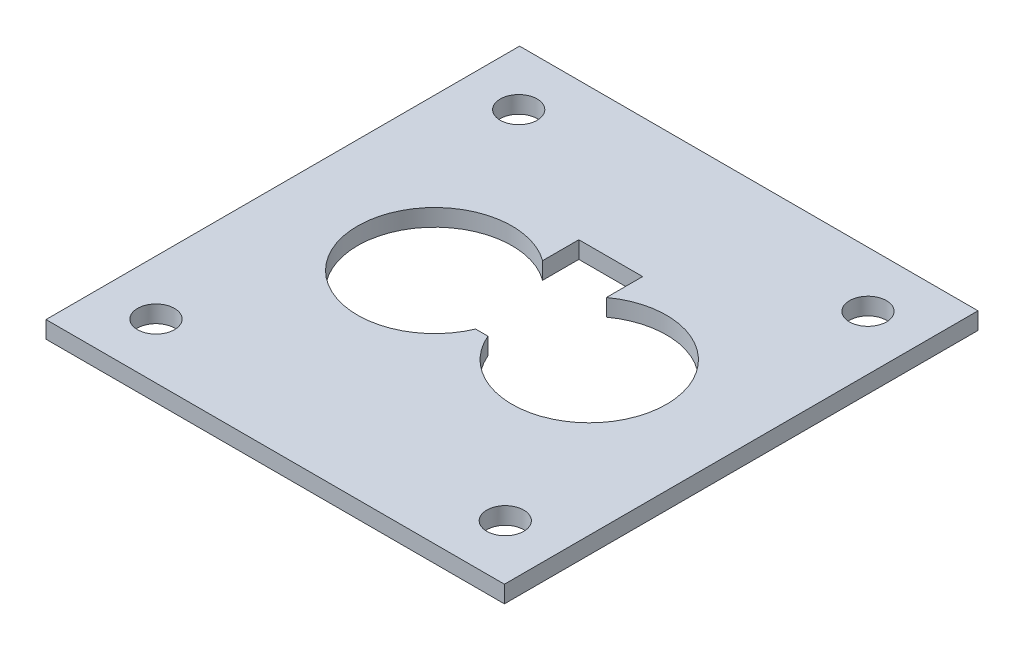
ISO-10303-21;
HEADER;
FILE_DESCRIPTION(('STEP AP214'),'2;1');
FILE_NAME('part.step','',(''),(''),'','','');
FILE_SCHEMA(('AUTOMOTIVE_DESIGN { 1 0 10303 214 1 1 1 1 }'));
ENDSEC;
DATA;
#1=APPLICATION_CONTEXT('core data for automotive mechanical design processes');
#2=APPLICATION_PROTOCOL_DEFINITION('international standard','automotive_design',2000,#1);
#3=PRODUCT_CONTEXT('',#1,'mechanical');
#4=PRODUCT('Part','Part','',(#3));
#5=PRODUCT_RELATED_PRODUCT_CATEGORY('part','',(#4));
#6=PRODUCT_DEFINITION_FORMATION('','',#4);
#7=PRODUCT_DEFINITION_CONTEXT('part definition',#1,'design');
#8=PRODUCT_DEFINITION('design','',#6,#7);
#9=PRODUCT_DEFINITION_SHAPE('','',#8);
#10=(LENGTH_UNIT() NAMED_UNIT(*) SI_UNIT(.MILLI.,.METRE.));
#11=(NAMED_UNIT(*) PLANE_ANGLE_UNIT() SI_UNIT($,.RADIAN.));
#12=(NAMED_UNIT(*) SI_UNIT($,.STERADIAN.) SOLID_ANGLE_UNIT());
#13=UNCERTAINTY_MEASURE_WITH_UNIT(LENGTH_MEASURE(1.E-05),#10,'distance_accuracy_value','');
#14=(GEOMETRIC_REPRESENTATION_CONTEXT(3) GLOBAL_UNCERTAINTY_ASSIGNED_CONTEXT((#13)) GLOBAL_UNIT_ASSIGNED_CONTEXT((#10,
#11,#12)) REPRESENTATION_CONTEXT('',''));
#15=CARTESIAN_POINT('',(0.,0.,0.));
#16=DIRECTION('',(0.,0.,1.));
#17=DIRECTION('',(1.,0.,0.));
#18=AXIS2_PLACEMENT_3D('',#15,#16,#17);
#19=CARTESIAN_POINT('',(34.1243299967711,2.54,35.2524070214577));
#20=DIRECTION('',(-1.,0.,0.));
#21=DIRECTION('',(0.,0.,1.));
#22=AXIS2_PLACEMENT_3D('',#19,#20,#21);
#23=PLANE('',#22);
#24=DIRECTION('',(0.,0.,-1.));
#25=VECTOR('',#24,1.);
#26=CARTESIAN_POINT('',(34.1243299967711,0.,35.2524070214577));
#27=LINE('',#26,#25);
#28=CARTESIAN_POINT('',(34.1243299967711,0.,35.2524070214577));
#29=VERTEX_POINT('',#28);
#30=CARTESIAN_POINT('',(34.1243299967711,0.,-35.2524070214577));
#31=VERTEX_POINT('',#30);
#32=EDGE_CURVE('E220',#29,#31,#27,.T.);
#33=ORIENTED_EDGE('',*,*,#32,.T.);
#34=DIRECTION('',(0.,-1.,0.));
#35=VECTOR('',#34,1.);
#36=CARTESIAN_POINT('',(34.1243299967711,2.54,-35.2524070214577));
#37=LINE('',#36,#35);
#38=CARTESIAN_POINT('',(34.1243299967711,2.54,-35.2524070214577));
#39=VERTEX_POINT('',#38);
#40=EDGE_CURVE('E11',#39,#31,#37,.T.);
#41=ORIENTED_EDGE('',*,*,#40,.F.);
#42=DIRECTION('',(0.,0.,-1.));
#43=VECTOR('',#42,1.);
#44=CARTESIAN_POINT('',(34.1243299967711,2.54,35.2524070214577));
#45=LINE('',#44,#43);
#46=CARTESIAN_POINT('',(34.1243299967711,2.54,35.2524070214577));
#47=VERTEX_POINT('',#46);
#48=EDGE_CURVE('E221',#47,#39,#45,.T.);
#49=ORIENTED_EDGE('',*,*,#48,.F.);
#50=DIRECTION('',(0.,-1.,0.));
#51=VECTOR('',#50,1.);
#52=CARTESIAN_POINT('',(34.1243299967711,2.54,35.2524070214577));
#53=LINE('',#52,#51);
#54=EDGE_CURVE('E235',#47,#29,#53,.T.);
#55=ORIENTED_EDGE('',*,*,#54,.T.);
#56=EDGE_LOOP('',(#33,#41,#49,#55));
#57=FACE_BOUND('',#56,.T.);
#58=ADVANCED_FACE('F43',(#57),#23,.F.);
#59=CARTESIAN_POINT('',(-34.1243299967711,2.54,-35.2524070214577));
#60=DIRECTION('',(0.,0.,1.));
#61=DIRECTION('',(1.,0.,0.));
#62=AXIS2_PLACEMENT_3D('',#59,#60,#61);
#63=PLANE('',#62);
#64=DIRECTION('',(-1.,0.,0.));
#65=VECTOR('',#64,1.);
#66=CARTESIAN_POINT('',(-34.1243299967711,0.,-35.2524070214577));
#67=LINE('',#66,#65);
#68=CARTESIAN_POINT('',(-34.1243299967711,0.,-35.2524070214577));
#69=VERTEX_POINT('',#68);
#70=EDGE_CURVE('E239',#31,#69,#67,.T.);
#71=ORIENTED_EDGE('',*,*,#70,.T.);
#72=DIRECTION('',(0.,-1.,0.));
#73=VECTOR('',#72,1.);
#74=CARTESIAN_POINT('',(-34.1243299967711,2.54,-35.2524070214577));
#75=LINE('',#74,#73);
#76=CARTESIAN_POINT('',(-34.1243299967711,2.54,-35.2524070214577));
#77=VERTEX_POINT('',#76);
#78=EDGE_CURVE('E51',#77,#69,#75,.T.);
#79=ORIENTED_EDGE('',*,*,#78,.F.);
#80=DIRECTION('',(-1.,0.,0.));
#81=VECTOR('',#80,1.);
#82=CARTESIAN_POINT('',(-34.1243299967711,2.54,-35.2524070214577));
#83=LINE('',#82,#81);
#84=EDGE_CURVE('E225',#39,#77,#83,.T.);
#85=ORIENTED_EDGE('',*,*,#84,.F.);
#86=ORIENTED_EDGE('',*,*,#40,.T.);
#87=EDGE_LOOP('',(#71,#79,#85,#86));
#88=FACE_BOUND('',#87,.T.);
#89=ADVANCED_FACE('F274',(#88),#63,.F.);
#90=CARTESIAN_POINT('',(-34.1243299967711,2.54,35.2524070214577));
#91=DIRECTION('',(1.,0.,0.));
#92=DIRECTION('',(0.,0.,-1.));
#93=AXIS2_PLACEMENT_3D('',#90,#91,#92);
#94=PLANE('',#93);
#95=DIRECTION('',(0.,0.,1.));
#96=VECTOR('',#95,1.);
#97=CARTESIAN_POINT('',(-34.1243299967711,0.,35.2524070214577));
#98=LINE('',#97,#96);
#99=CARTESIAN_POINT('',(-34.1243299967711,0.,35.2524070214577));
#100=VERTEX_POINT('',#99);
#101=EDGE_CURVE('E242',#69,#100,#98,.T.);
#102=ORIENTED_EDGE('',*,*,#101,.T.);
#103=DIRECTION('',(0.,-1.,0.));
#104=VECTOR('',#103,1.);
#105=CARTESIAN_POINT('',(-34.1243299967711,2.54,35.2524070214577));
#106=LINE('',#105,#104);
#107=CARTESIAN_POINT('',(-34.1243299967711,2.54,35.2524070214577));
#108=VERTEX_POINT('',#107);
#109=EDGE_CURVE('E250',#108,#100,#106,.T.);
#110=ORIENTED_EDGE('',*,*,#109,.F.);
#111=DIRECTION('',(0.,0.,1.));
#112=VECTOR('',#111,1.);
#113=CARTESIAN_POINT('',(-34.1243299967711,2.54,35.2524070214577));
#114=LINE('',#113,#112);
#115=EDGE_CURVE('E229',#77,#108,#114,.T.);
#116=ORIENTED_EDGE('',*,*,#115,.F.);
#117=ORIENTED_EDGE('',*,*,#78,.T.);
#118=EDGE_LOOP('',(#102,#110,#116,#117));
#119=FACE_BOUND('',#118,.T.);
#120=ADVANCED_FACE('F259',(#119),#94,.F.);
#121=CARTESIAN_POINT('',(-34.1243299967711,2.54,35.2524070214577));
#122=DIRECTION('',(0.,0.,-1.));
#123=DIRECTION('',(-1.,0.,0.));
#124=AXIS2_PLACEMENT_3D('',#121,#122,#123);
#125=PLANE('',#124);
#126=DIRECTION('',(1.,0.,0.));
#127=VECTOR('',#126,1.);
#128=CARTESIAN_POINT('',(-34.1243299967711,0.,35.2524070214577));
#129=LINE('',#128,#127);
#130=EDGE_CURVE('E226',#100,#29,#129,.T.);
#131=ORIENTED_EDGE('',*,*,#130,.T.);
#132=ORIENTED_EDGE('',*,*,#54,.F.);
#133=DIRECTION('',(1.,0.,0.));
#134=VECTOR('',#133,1.);
#135=CARTESIAN_POINT('',(-34.1243299967711,2.54,35.2524070214577));
#136=LINE('',#135,#134);
#137=EDGE_CURVE('E232',#108,#47,#136,.T.);
#138=ORIENTED_EDGE('',*,*,#137,.F.);
#139=ORIENTED_EDGE('',*,*,#109,.T.);
#140=EDGE_LOOP('',(#131,#132,#138,#139));
#141=FACE_BOUND('',#140,.T.);
#142=ADVANCED_FACE('F267',(#141),#125,.F.);
#143=CARTESIAN_POINT('',(0.,2.54,0.));
#144=DIRECTION('',(0.,-1.,0.));
#145=DIRECTION('',(0.,0.,-1.));
#146=AXIS2_PLACEMENT_3D('',#143,#144,#145);
#147=PLANE('',#146);
#148=CARTESIAN_POINT('',(11.5,2.54,0.));
#149=DIRECTION('',(0.,1.,0.));
#150=DIRECTION('',(0.,0.,1.));
#151=AXIS2_PLACEMENT_3D('',#148,#149,#150);
#152=CIRCLE('',#151,11.5);
#153=CARTESIAN_POINT('',(0.916994755741638,2.54,4.5));
#154=VERTEX_POINT('',#153);
#155=CARTESIAN_POINT('',(4.75,2.54,-9.31061222476804));
#156=VERTEX_POINT('',#155);
#157=EDGE_CURVE('E160',#154,#156,#152,.T.);
#158=ORIENTED_EDGE('',*,*,#157,.F.);
#159=DIRECTION('',(1.,0.,0.));
#160=VECTOR('',#159,1.);
#161=CARTESIAN_POINT('',(0.,2.54,4.5));
#162=LINE('',#161,#160);
#163=CARTESIAN_POINT('',(-0.916994755741637,2.54,4.5));
#164=VERTEX_POINT('',#163);
#165=EDGE_CURVE('E58',#164,#154,#162,.T.);
#166=ORIENTED_EDGE('',*,*,#165,.F.);
#167=CARTESIAN_POINT('',(-11.5,2.54,0.));
#168=DIRECTION('',(0.,1.,0.));
#169=DIRECTION('',(0.,0.,1.));
#170=AXIS2_PLACEMENT_3D('',#167,#168,#169);
#171=CIRCLE('',#170,11.5);
#172=CARTESIAN_POINT('',(-4.75,2.54,-9.31061222476803));
#173=VERTEX_POINT('',#172);
#174=EDGE_CURVE('E141',#173,#164,#171,.T.);
#175=ORIENTED_EDGE('',*,*,#174,.F.);
#176=DIRECTION('',(0.,0.,1.));
#177=VECTOR('',#176,1.);
#178=CARTESIAN_POINT('',(-4.75,2.54,0.));
#179=LINE('',#178,#177);
#180=CARTESIAN_POINT('',(-4.75,2.54,-14.7));
#181=VERTEX_POINT('',#180);
#182=EDGE_CURVE('E145',#181,#173,#179,.T.);
#183=ORIENTED_EDGE('',*,*,#182,.F.);
#184=DIRECTION('',(1.,0.,0.));
#185=VECTOR('',#184,1.);
#186=CARTESIAN_POINT('',(0.,2.54,-14.7));
#187=LINE('',#186,#185);
#188=CARTESIAN_POINT('',(4.75,2.54,-14.7));
#189=VERTEX_POINT('',#188);
#190=EDGE_CURVE('E167',#181,#189,#187,.T.);
#191=ORIENTED_EDGE('',*,*,#190,.T.);
#192=DIRECTION('',(0.,0.,1.));
#193=VECTOR('',#192,1.);
#194=CARTESIAN_POINT('',(4.75,2.54,0.));
#195=LINE('',#194,#193);
#196=EDGE_CURVE('E163',#189,#156,#195,.T.);
#197=ORIENTED_EDGE('',*,*,#196,.T.);
#198=EDGE_LOOP('',(#158,#166,#175,#183,#191,#197));
#199=FACE_BOUND('',#198,.T.);
#200=CARTESIAN_POINT('',(26.,2.54,-27.));
#201=DIRECTION('',(0.,1.,0.));
#202=DIRECTION('',(0.,0.,1.));
#203=AXIS2_PLACEMENT_3D('',#200,#201,#202);
#204=CIRCLE('',#203,2.75);
#205=CARTESIAN_POINT('',(26.,2.54,-24.25));
#206=VERTEX_POINT('',#205);
#207=EDGE_CURVE('E177',#206,#206,#204,.T.);
#208=ORIENTED_EDGE('',*,*,#207,.F.);
#209=EDGE_LOOP('',(#208));
#210=FACE_BOUND('',#209,.T.);
#211=CARTESIAN_POINT('',(-26.,2.54,-27.));
#212=DIRECTION('',(0.,1.,0.));
#213=DIRECTION('',(0.,0.,1.));
#214=AXIS2_PLACEMENT_3D('',#211,#212,#213);
#215=CIRCLE('',#214,2.75);
#216=CARTESIAN_POINT('',(-26.,2.54,-24.25));
#217=VERTEX_POINT('',#216);
#218=EDGE_CURVE('E196',#217,#217,#215,.T.);
#219=ORIENTED_EDGE('',*,*,#218,.F.);
#220=EDGE_LOOP('',(#219));
#221=FACE_BOUND('',#220,.T.);
#222=CARTESIAN_POINT('',(-26.,2.54,27.));
#223=DIRECTION('',(0.,1.,0.));
#224=DIRECTION('',(0.,0.,1.));
#225=AXIS2_PLACEMENT_3D('',#222,#223,#224);
#226=CIRCLE('',#225,2.75);
#227=CARTESIAN_POINT('',(-26.,2.54,29.75));
#228=VERTEX_POINT('',#227);
#229=EDGE_CURVE('E204',#228,#228,#226,.T.);
#230=ORIENTED_EDGE('',*,*,#229,.F.);
#231=EDGE_LOOP('',(#230));
#232=FACE_BOUND('',#231,.T.);
#233=CARTESIAN_POINT('',(26.,2.54,27.));
#234=DIRECTION('',(0.,1.,0.));
#235=DIRECTION('',(0.,0.,1.));
#236=AXIS2_PLACEMENT_3D('',#233,#234,#235);
#237=CIRCLE('',#236,2.75);
#238=CARTESIAN_POINT('',(26.,2.54,29.75));
#239=VERTEX_POINT('',#238);
#240=EDGE_CURVE('E212',#239,#239,#237,.T.);
#241=ORIENTED_EDGE('',*,*,#240,.F.);
#242=EDGE_LOOP('',(#241));
#243=FACE_BOUND('',#242,.T.);
#244=ORIENTED_EDGE('',*,*,#48,.T.);
#245=ORIENTED_EDGE('',*,*,#84,.T.);
#246=ORIENTED_EDGE('',*,*,#115,.T.);
#247=ORIENTED_EDGE('',*,*,#137,.T.);
#248=EDGE_LOOP('',(#244,#245,#246,#247));
#249=FACE_BOUND('',#248,.T.);
#250=ADVANCED_FACE('F273',(#199,#210,#221,#232,#243,#249),#147,.F.);
#251=CARTESIAN_POINT('',(0.,0.,0.));
#252=DIRECTION('',(0.,-1.,0.));
#253=DIRECTION('',(0.,0.,-1.));
#254=AXIS2_PLACEMENT_3D('',#251,#252,#253);
#255=PLANE('',#254);
#256=DIRECTION('',(1.,0.,0.));
#257=VECTOR('',#256,1.);
#258=CARTESIAN_POINT('',(0.,0.,4.5));
#259=LINE('',#258,#257);
#260=CARTESIAN_POINT('',(-0.916994755741637,0.,4.5));
#261=VERTEX_POINT('',#260);
#262=CARTESIAN_POINT('',(0.916994755741638,0.,4.5));
#263=VERTEX_POINT('',#262);
#264=EDGE_CURVE('E122',#261,#263,#259,.T.);
#265=ORIENTED_EDGE('',*,*,#264,.T.);
#266=CARTESIAN_POINT('',(11.5,0.,0.));
#267=DIRECTION('',(0.,1.,0.));
#268=DIRECTION('',(0.,0.,1.));
#269=AXIS2_PLACEMENT_3D('',#266,#267,#268);
#270=CIRCLE('',#269,11.5);
#271=CARTESIAN_POINT('',(4.75,0.,-9.31061222476804));
#272=VERTEX_POINT('',#271);
#273=EDGE_CURVE('E129',#263,#272,#270,.T.);
#274=ORIENTED_EDGE('',*,*,#273,.T.);
#275=DIRECTION('',(0.,0.,1.));
#276=VECTOR('',#275,1.);
#277=CARTESIAN_POINT('',(4.75,0.,0.));
#278=LINE('',#277,#276);
#279=CARTESIAN_POINT('',(4.75,0.,-14.7));
#280=VERTEX_POINT('',#279);
#281=EDGE_CURVE('E134',#280,#272,#278,.T.);
#282=ORIENTED_EDGE('',*,*,#281,.F.);
#283=DIRECTION('',(1.,0.,0.));
#284=VECTOR('',#283,1.);
#285=CARTESIAN_POINT('',(0.,0.,-14.7));
#286=LINE('',#285,#284);
#287=CARTESIAN_POINT('',(-4.75,0.,-14.7));
#288=VERTEX_POINT('',#287);
#289=EDGE_CURVE('E150',#288,#280,#286,.T.);
#290=ORIENTED_EDGE('',*,*,#289,.F.);
#291=DIRECTION('',(0.,0.,1.));
#292=VECTOR('',#291,1.);
#293=CARTESIAN_POINT('',(-4.75,0.,0.));
#294=LINE('',#293,#292);
#295=CARTESIAN_POINT('',(-4.75,0.,-9.31061222476803));
#296=VERTEX_POINT('',#295);
#297=EDGE_CURVE('E153',#288,#296,#294,.T.);
#298=ORIENTED_EDGE('',*,*,#297,.T.);
#299=CARTESIAN_POINT('',(-11.5,0.,0.));
#300=DIRECTION('',(0.,1.,0.));
#301=DIRECTION('',(0.,0.,1.));
#302=AXIS2_PLACEMENT_3D('',#299,#300,#301);
#303=CIRCLE('',#302,11.5);
#304=EDGE_CURVE('E126',#296,#261,#303,.T.);
#305=ORIENTED_EDGE('',*,*,#304,.T.);
#306=EDGE_LOOP('',(#265,#274,#282,#290,#298,#305));
#307=FACE_BOUND('',#306,.T.);
#308=CARTESIAN_POINT('',(26.,0.,-27.));
#309=DIRECTION('',(0.,-1.,0.));
#310=DIRECTION('',(0.,0.,-1.));
#311=AXIS2_PLACEMENT_3D('',#308,#309,#310);
#312=CIRCLE('',#311,2.75);
#313=CARTESIAN_POINT('',(26.,0.,-29.75));
#314=VERTEX_POINT('',#313);
#315=EDGE_CURVE('E192',#314,#314,#312,.T.);
#316=ORIENTED_EDGE('',*,*,#315,.F.);
#317=EDGE_LOOP('',(#316));
#318=FACE_BOUND('',#317,.T.);
#319=CARTESIAN_POINT('',(-26.,0.,-27.));
#320=DIRECTION('',(0.,-1.,0.));
#321=DIRECTION('',(0.,0.,-1.));
#322=AXIS2_PLACEMENT_3D('',#319,#320,#321);
#323=CIRCLE('',#322,2.75);
#324=CARTESIAN_POINT('',(-26.,0.,-29.75));
#325=VERTEX_POINT('',#324);
#326=EDGE_CURVE('E200',#325,#325,#323,.T.);
#327=ORIENTED_EDGE('',*,*,#326,.F.);
#328=EDGE_LOOP('',(#327));
#329=FACE_BOUND('',#328,.T.);
#330=CARTESIAN_POINT('',(-26.,0.,27.));
#331=DIRECTION('',(0.,-1.,0.));
#332=DIRECTION('',(0.,0.,-1.));
#333=AXIS2_PLACEMENT_3D('',#330,#331,#332);
#334=CIRCLE('',#333,2.75);
#335=CARTESIAN_POINT('',(-26.,0.,24.25));
#336=VERTEX_POINT('',#335);
#337=EDGE_CURVE('E208',#336,#336,#334,.T.);
#338=ORIENTED_EDGE('',*,*,#337,.F.);
#339=EDGE_LOOP('',(#338));
#340=FACE_BOUND('',#339,.T.);
#341=CARTESIAN_POINT('',(26.,0.,27.));
#342=DIRECTION('',(0.,-1.,0.));
#343=DIRECTION('',(0.,0.,-1.));
#344=AXIS2_PLACEMENT_3D('',#341,#342,#343);
#345=CIRCLE('',#344,2.75);
#346=CARTESIAN_POINT('',(26.,0.,24.25));
#347=VERTEX_POINT('',#346);
#348=EDGE_CURVE('E216',#347,#347,#345,.T.);
#349=ORIENTED_EDGE('',*,*,#348,.F.);
#350=EDGE_LOOP('',(#349));
#351=FACE_BOUND('',#350,.T.);
#352=ORIENTED_EDGE('',*,*,#32,.F.);
#353=ORIENTED_EDGE('',*,*,#130,.F.);
#354=ORIENTED_EDGE('',*,*,#101,.F.);
#355=ORIENTED_EDGE('',*,*,#70,.F.);
#356=EDGE_LOOP('',(#352,#353,#354,#355));
#357=FACE_BOUND('',#356,.T.);
#358=ADVANCED_FACE('F136',(#307,#318,#329,#340,#351,#357),#255,.T.);
#359=CARTESIAN_POINT('',(26.,2.54,27.));
#360=DIRECTION('',(0.,1.,0.));
#361=DIRECTION('',(0.,0.,1.));
#362=AXIS2_PLACEMENT_3D('',#359,#360,#361);
#363=CYLINDRICAL_SURFACE('',#362,2.75);
#364=ORIENTED_EDGE('',*,*,#240,.T.);
#365=EDGE_LOOP('',(#364));
#366=FACE_BOUND('',#365,.T.);
#367=ORIENTED_EDGE('',*,*,#348,.T.);
#368=EDGE_LOOP('',(#367));
#369=FACE_BOUND('',#368,.T.);
#370=ADVANCED_FACE('F286',(#366,#369),#363,.F.);
#371=CARTESIAN_POINT('',(-26.,2.54,27.));
#372=DIRECTION('',(0.,1.,0.));
#373=DIRECTION('',(0.,0.,1.));
#374=AXIS2_PLACEMENT_3D('',#371,#372,#373);
#375=CYLINDRICAL_SURFACE('',#374,2.75);
#376=ORIENTED_EDGE('',*,*,#229,.T.);
#377=EDGE_LOOP('',(#376));
#378=FACE_BOUND('',#377,.T.);
#379=ORIENTED_EDGE('',*,*,#337,.T.);
#380=EDGE_LOOP('',(#379));
#381=FACE_BOUND('',#380,.T.);
#382=ADVANCED_FACE('F292',(#378,#381),#375,.F.);
#383=CARTESIAN_POINT('',(-26.,2.54,-27.));
#384=DIRECTION('',(0.,1.,0.));
#385=DIRECTION('',(0.,0.,1.));
#386=AXIS2_PLACEMENT_3D('',#383,#384,#385);
#387=CYLINDRICAL_SURFACE('',#386,2.75);
#388=ORIENTED_EDGE('',*,*,#218,.T.);
#389=EDGE_LOOP('',(#388));
#390=FACE_BOUND('',#389,.T.);
#391=ORIENTED_EDGE('',*,*,#326,.T.);
#392=EDGE_LOOP('',(#391));
#393=FACE_BOUND('',#392,.T.);
#394=ADVANCED_FACE('F296',(#390,#393),#387,.F.);
#395=CARTESIAN_POINT('',(26.,2.54,-27.));
#396=DIRECTION('',(0.,1.,0.));
#397=DIRECTION('',(0.,0.,1.));
#398=AXIS2_PLACEMENT_3D('',#395,#396,#397);
#399=CYLINDRICAL_SURFACE('',#398,2.75);
#400=ORIENTED_EDGE('',*,*,#207,.T.);
#401=EDGE_LOOP('',(#400));
#402=FACE_BOUND('',#401,.T.);
#403=ORIENTED_EDGE('',*,*,#315,.T.);
#404=EDGE_LOOP('',(#403));
#405=FACE_BOUND('',#404,.T.);
#406=ADVANCED_FACE('F300',(#402,#405),#399,.F.);
#407=CARTESIAN_POINT('',(0.,0.,4.5));
#408=DIRECTION('',(0.,0.,1.));
#409=DIRECTION('',(1.,0.,0.));
#410=AXIS2_PLACEMENT_3D('',#407,#408,#409);
#411=PLANE('',#410);
#412=ORIENTED_EDGE('',*,*,#165,.T.);
#413=DIRECTION('',(0.,1.,0.));
#414=VECTOR('',#413,1.);
#415=CARTESIAN_POINT('',(0.916994755741638,0.,4.5));
#416=LINE('',#415,#414);
#417=EDGE_CURVE('E119',#263,#154,#416,.T.);
#418=ORIENTED_EDGE('',*,*,#417,.F.);
#419=ORIENTED_EDGE('',*,*,#264,.F.);
#420=DIRECTION('',(0.,1.,0.));
#421=VECTOR('',#420,1.);
#422=CARTESIAN_POINT('',(-0.916994755741637,0.,4.5));
#423=LINE('',#422,#421);
#424=EDGE_CURVE('E174',#261,#164,#423,.T.);
#425=ORIENTED_EDGE('',*,*,#424,.T.);
#426=EDGE_LOOP('',(#412,#418,#419,#425));
#427=FACE_BOUND('',#426,.T.);
#428=ADVANCED_FACE('F120',(#427),#411,.F.);
#429=CARTESIAN_POINT('',(-11.5,0.,0.));
#430=DIRECTION('',(0.,1.,0.));
#431=DIRECTION('',(0.,0.,1.));
#432=AXIS2_PLACEMENT_3D('',#429,#430,#431);
#433=CYLINDRICAL_SURFACE('',#432,11.5);
#434=ORIENTED_EDGE('',*,*,#174,.T.);
#435=ORIENTED_EDGE('',*,*,#424,.F.);
#436=ORIENTED_EDGE('',*,*,#304,.F.);
#437=DIRECTION('',(0.,1.,0.));
#438=VECTOR('',#437,1.);
#439=CARTESIAN_POINT('',(-4.75,0.,-9.31061222476803));
#440=LINE('',#439,#438);
#441=EDGE_CURVE('E178',#296,#173,#440,.T.);
#442=ORIENTED_EDGE('',*,*,#441,.T.);
#443=EDGE_LOOP('',(#434,#435,#436,#442));
#444=FACE_BOUND('',#443,.T.);
#445=ADVANCED_FACE('F307',(#444),#433,.F.);
#446=CARTESIAN_POINT('',(-4.75,0.,0.));
#447=DIRECTION('',(-1.,0.,0.));
#448=DIRECTION('',(0.,0.,1.));
#449=AXIS2_PLACEMENT_3D('',#446,#447,#448);
#450=PLANE('',#449);
#451=ORIENTED_EDGE('',*,*,#182,.T.);
#452=ORIENTED_EDGE('',*,*,#441,.F.);
#453=ORIENTED_EDGE('',*,*,#297,.F.);
#454=DIRECTION('',(0.,1.,0.));
#455=VECTOR('',#454,1.);
#456=CARTESIAN_POINT('',(-4.75,0.,-14.7));
#457=LINE('',#456,#455);
#458=EDGE_CURVE('E181',#288,#181,#457,.T.);
#459=ORIENTED_EDGE('',*,*,#458,.T.);
#460=EDGE_LOOP('',(#451,#452,#453,#459));
#461=FACE_BOUND('',#460,.T.);
#462=ADVANCED_FACE('F317',(#461),#450,.F.);
#463=CARTESIAN_POINT('',(0.,0.,-14.7));
#464=DIRECTION('',(0.,0.,1.));
#465=DIRECTION('',(1.,0.,0.));
#466=AXIS2_PLACEMENT_3D('',#463,#464,#465);
#467=PLANE('',#466);
#468=ORIENTED_EDGE('',*,*,#190,.F.);
#469=ORIENTED_EDGE('',*,*,#458,.F.);
#470=ORIENTED_EDGE('',*,*,#289,.T.);
#471=DIRECTION('',(0.,1.,0.));
#472=VECTOR('',#471,1.);
#473=CARTESIAN_POINT('',(4.75,0.,-14.7));
#474=LINE('',#473,#472);
#475=EDGE_CURVE('E184',#280,#189,#474,.T.);
#476=ORIENTED_EDGE('',*,*,#475,.T.);
#477=EDGE_LOOP('',(#468,#469,#470,#476));
#478=FACE_BOUND('',#477,.T.);
#479=ADVANCED_FACE('F313',(#478),#467,.T.);
#480=CARTESIAN_POINT('',(4.75,0.,0.));
#481=DIRECTION('',(-1.,0.,0.));
#482=DIRECTION('',(0.,0.,1.));
#483=AXIS2_PLACEMENT_3D('',#480,#481,#482);
#484=PLANE('',#483);
#485=ORIENTED_EDGE('',*,*,#196,.F.);
#486=ORIENTED_EDGE('',*,*,#475,.F.);
#487=ORIENTED_EDGE('',*,*,#281,.T.);
#488=DIRECTION('',(0.,1.,0.));
#489=VECTOR('',#488,1.);
#490=CARTESIAN_POINT('',(4.75,0.,-9.31061222476804));
#491=LINE('',#490,#489);
#492=EDGE_CURVE('E66',#272,#156,#491,.T.);
#493=ORIENTED_EDGE('',*,*,#492,.T.);
#494=EDGE_LOOP('',(#485,#486,#487,#493));
#495=FACE_BOUND('',#494,.T.);
#496=ADVANCED_FACE('F310',(#495),#484,.T.);
#497=CARTESIAN_POINT('',(11.5,0.,0.));
#498=DIRECTION('',(0.,1.,0.));
#499=DIRECTION('',(0.,0.,1.));
#500=AXIS2_PLACEMENT_3D('',#497,#498,#499);
#501=CYLINDRICAL_SURFACE('',#500,11.5);
#502=ORIENTED_EDGE('',*,*,#157,.T.);
#503=ORIENTED_EDGE('',*,*,#492,.F.);
#504=ORIENTED_EDGE('',*,*,#273,.F.);
#505=ORIENTED_EDGE('',*,*,#417,.T.);
#506=EDGE_LOOP('',(#502,#503,#504,#505));
#507=FACE_BOUND('',#506,.T.);
#508=ADVANCED_FACE('F130',(#507),#501,.F.);
#509=CLOSED_SHELL('',(#58,#89,#120,#142,#250,#358,#370,#382,#394,#406,#428,#445,#462,#479,#496,#508));
#510=MANIFOLD_SOLID_BREP('B2',#509);
#511=ADVANCED_BREP_SHAPE_REPRESENTATION('',(#18,#510),#14);
#512=SHAPE_DEFINITION_REPRESENTATION(#9,#511);
ENDSEC;
END-ISO-10303-21;
